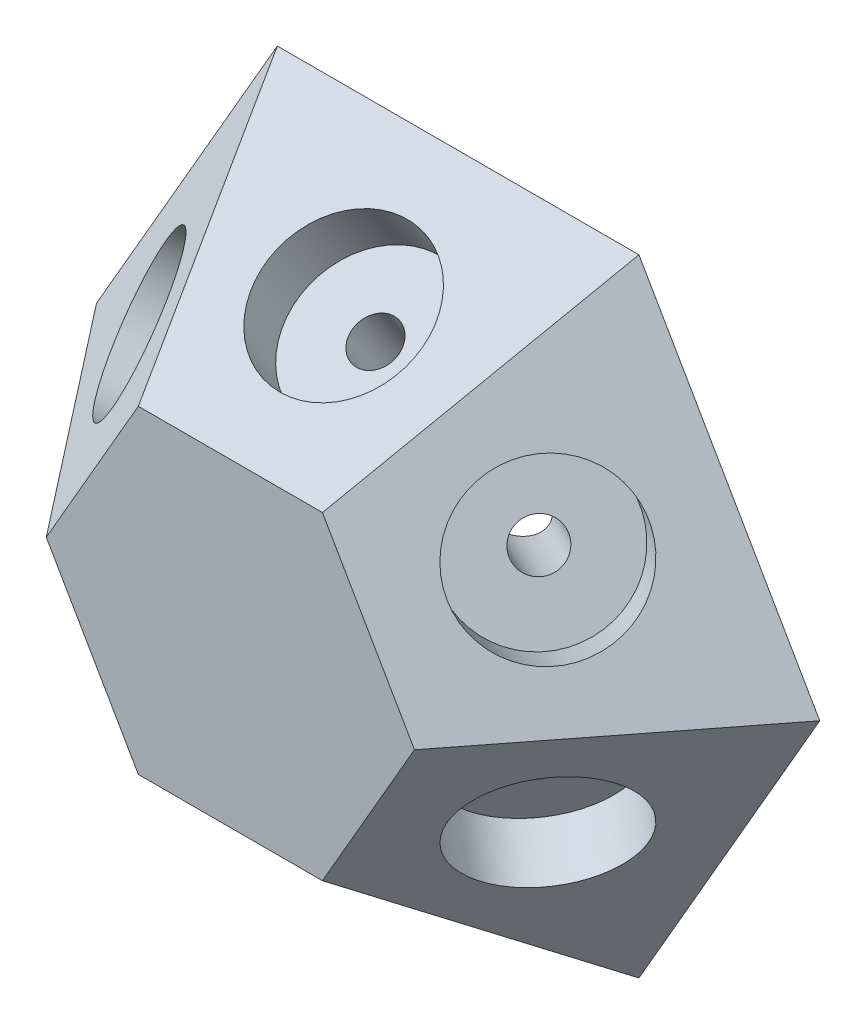
ISO-10303-21;
HEADER;
FILE_DESCRIPTION(('STEP AP214'),'2;1');
FILE_NAME('part.step','',(''),(''),'','','');
FILE_SCHEMA(('AUTOMOTIVE_DESIGN { 1 0 10303 214 1 1 1 1 }'));
ENDSEC;
DATA;
#1=APPLICATION_CONTEXT('core data for automotive mechanical design processes');
#2=APPLICATION_PROTOCOL_DEFINITION('international standard','automotive_design',2000,#1);
#3=PRODUCT_CONTEXT('',#1,'mechanical');
#4=PRODUCT('Part','Part','',(#3));
#5=PRODUCT_RELATED_PRODUCT_CATEGORY('part','',(#4));
#6=PRODUCT_DEFINITION_FORMATION('','',#4);
#7=PRODUCT_DEFINITION_CONTEXT('part definition',#1,'design');
#8=PRODUCT_DEFINITION('design','',#6,#7);
#9=PRODUCT_DEFINITION_SHAPE('','',#8);
#10=(LENGTH_UNIT() NAMED_UNIT(*) SI_UNIT(.MILLI.,.METRE.));
#11=(NAMED_UNIT(*) PLANE_ANGLE_UNIT() SI_UNIT($,.RADIAN.));
#12=(NAMED_UNIT(*) SI_UNIT($,.STERADIAN.) SOLID_ANGLE_UNIT());
#13=UNCERTAINTY_MEASURE_WITH_UNIT(LENGTH_MEASURE(1.E-05),#10,'distance_accuracy_value','');
#14=(GEOMETRIC_REPRESENTATION_CONTEXT(3) GLOBAL_UNCERTAINTY_ASSIGNED_CONTEXT((#13)) GLOBAL_UNIT_ASSIGNED_CONTEXT((#10,
#11,#12)) REPRESENTATION_CONTEXT('',''));
#15=CARTESIAN_POINT('',(0.,0.,0.));
#16=DIRECTION('',(0.,0.,1.));
#17=DIRECTION('',(1.,0.,0.));
#18=AXIS2_PLACEMENT_3D('',#15,#16,#17);
#19=CARTESIAN_POINT('',(0.,0.,20.));
#20=DIRECTION('',(0.,0.,1.));
#21=DIRECTION('',(1.,0.,0.));
#22=AXIS2_PLACEMENT_3D('',#19,#20,#21);
#23=PLANE('',#22);
#24=DIRECTION('',(-0.5,-0.866025403784439,0.));
#25=VECTOR('',#24,1.);
#26=CARTESIAN_POINT('',(-8.08290376865476,14.,20.));
#27=LINE('',#26,#25);
#28=CARTESIAN_POINT('',(-8.08290376865476,14.,20.));
#29=VERTEX_POINT('',#28);
#30=CARTESIAN_POINT('',(-16.1658075373095,0.,20.));
#31=VERTEX_POINT('',#30);
#32=EDGE_CURVE('E130',#29,#31,#27,.T.);
#33=ORIENTED_EDGE('',*,*,#32,.T.);
#34=DIRECTION('',(0.5,-0.866025403784438,0.));
#35=VECTOR('',#34,1.);
#36=CARTESIAN_POINT('',(-16.1658075373095,0.,20.));
#37=LINE('',#36,#35);
#38=CARTESIAN_POINT('',(-8.08290376865476,-14.,20.));
#39=VERTEX_POINT('',#38);
#40=EDGE_CURVE('E177',#31,#39,#37,.T.);
#41=ORIENTED_EDGE('',*,*,#40,.T.);
#42=DIRECTION('',(1.,0.,0.));
#43=VECTOR('',#42,1.);
#44=CARTESIAN_POINT('',(-8.08290376865476,-14.,20.));
#45=LINE('',#44,#43);
#46=CARTESIAN_POINT('',(8.08290376865476,-14.,20.));
#47=VERTEX_POINT('',#46);
#48=EDGE_CURVE('E335',#39,#47,#45,.T.);
#49=ORIENTED_EDGE('',*,*,#48,.T.);
#50=DIRECTION('',(0.5,0.866025403784439,0.));
#51=VECTOR('',#50,1.);
#52=CARTESIAN_POINT('',(8.08290376865476,-14.,20.));
#53=LINE('',#52,#51);
#54=CARTESIAN_POINT('',(16.1658075373095,0.,20.));
#55=VERTEX_POINT('',#54);
#56=EDGE_CURVE('E329',#47,#55,#53,.T.);
#57=ORIENTED_EDGE('',*,*,#56,.T.);
#58=DIRECTION('',(-0.5,0.866025403784439,0.));
#59=VECTOR('',#58,1.);
#60=CARTESIAN_POINT('',(16.1658075373095,0.,20.));
#61=LINE('',#60,#59);
#62=CARTESIAN_POINT('',(8.08290376865476,14.,20.));
#63=VERTEX_POINT('',#62);
#64=EDGE_CURVE('E57',#55,#63,#61,.T.);
#65=ORIENTED_EDGE('',*,*,#64,.T.);
#66=DIRECTION('',(-1.,0.,0.));
#67=VECTOR('',#66,1.);
#68=CARTESIAN_POINT('',(8.08290376865476,14.,20.));
#69=LINE('',#68,#67);
#70=EDGE_CURVE('E12',#63,#29,#69,.T.);
#71=ORIENTED_EDGE('',*,*,#70,.T.);
#72=EDGE_LOOP('',(#33,#41,#49,#57,#65,#71));
#73=FACE_BOUND('',#72,.T.);
#74=ADVANCED_FACE('F47',(#73),#23,.T.);
#75=CARTESIAN_POINT('',(0.,0.,0.));
#76=DIRECTION('',(0.,0.,1.));
#77=DIRECTION('',(1.,0.,0.));
#78=AXIS2_PLACEMENT_3D('',#75,#76,#77);
#79=PLANE('',#78);
#80=CARTESIAN_POINT('',(5.03951628677124,2.90956608475287,0.));
#81=DIRECTION('',(0.,0.,1.));
#82=DIRECTION('',(0.86602540378444,0.499999999999998,0.));
#83=AXIS2_PLACEMENT_3D('',#80,#81,#82);
#84=ELLIPSE('',#83,3.57479363318923,2.);
#85=CARTESIAN_POINT('',(8.13537838639999,4.69696290134747,0.));
#86=VERTEX_POINT('',#85);
#87=EDGE_CURVE('E414',#86,#86,#84,.T.);
#88=ORIENTED_EDGE('',*,*,#87,.T.);
#89=EDGE_LOOP('',(#88));
#90=FACE_BOUND('',#89,.T.);
#91=CARTESIAN_POINT('',(5.03951628677123,-2.9095660847529,0.));
#92=DIRECTION('',(0.,0.,1.));
#93=DIRECTION('',(0.866025403784436,-0.500000000000004,0.));
#94=AXIS2_PLACEMENT_3D('',#91,#92,#93);
#95=ELLIPSE('',#94,3.57479363318923,2.);
#96=CARTESIAN_POINT('',(8.13537838639996,-4.69696290134753,0.));
#97=VERTEX_POINT('',#96);
#98=EDGE_CURVE('E419',#97,#97,#95,.T.);
#99=ORIENTED_EDGE('',*,*,#98,.T.);
#100=EDGE_LOOP('',(#99));
#101=FACE_BOUND('',#100,.T.);
#102=CARTESIAN_POINT('',(0.,-5.81913216950575,0.));
#103=DIRECTION('',(0.,0.,1.));
#104=DIRECTION('',(0.,-1.,0.));
#105=AXIS2_PLACEMENT_3D('',#102,#103,#104);
#106=ELLIPSE('',#105,3.57479363318923,2.);
#107=CARTESIAN_POINT('',(0.,-9.39392580269499,0.));
#108=VERTEX_POINT('',#107);
#109=EDGE_CURVE('E422',#108,#108,#106,.T.);
#110=ORIENTED_EDGE('',*,*,#109,.T.);
#111=EDGE_LOOP('',(#110));
#112=FACE_BOUND('',#111,.T.);
#113=CARTESIAN_POINT('',(-5.0395162867712,2.90956608475293,0.));
#114=DIRECTION('',(0.,0.,1.));
#115=DIRECTION('',(-0.866025403784433,0.50000000000001,0.));
#116=AXIS2_PLACEMENT_3D('',#113,#114,#115);
#117=ELLIPSE('',#116,3.57479363318923,2.);
#118=CARTESIAN_POINT('',(-8.13537838639992,4.69696290134759,0.));
#119=VERTEX_POINT('',#118);
#120=EDGE_CURVE('E428',#119,#119,#117,.T.);
#121=ORIENTED_EDGE('',*,*,#120,.T.);
#122=EDGE_LOOP('',(#121));
#123=FACE_BOUND('',#122,.T.);
#124=CARTESIAN_POINT('',(-5.03951628677126,-2.90956608475283,0.));
#125=DIRECTION('',(0.,0.,1.));
#126=DIRECTION('',(-0.866025403784443,-0.499999999999992,0.));
#127=AXIS2_PLACEMENT_3D('',#124,#125,#126);
#128=ELLIPSE('',#127,3.57479363318923,2.);
#129=CARTESIAN_POINT('',(-8.13537838640003,-4.69696290134742,0.));
#130=VERTEX_POINT('',#129);
#131=EDGE_CURVE('E425',#130,#130,#128,.T.);
#132=ORIENTED_EDGE('',*,*,#131,.T.);
#133=EDGE_LOOP('',(#132));
#134=FACE_BOUND('',#133,.T.);
#135=CARTESIAN_POINT('',(0.,5.81913216950575,0.));
#136=DIRECTION('',(0.,0.,1.));
#137=DIRECTION('',(0.,1.,0.));
#138=AXIS2_PLACEMENT_3D('',#135,#136,#137);
#139=ELLIPSE('',#138,3.57479363318923,2.);
#140=CARTESIAN_POINT('',(0.,9.39392580269499,0.));
#141=VERTEX_POINT('',#140);
#142=EDGE_CURVE('E378',#141,#141,#139,.T.);
#143=ORIENTED_EDGE('',*,*,#142,.T.);
#144=EDGE_LOOP('',(#143));
#145=FACE_BOUND('',#144,.T.);
#146=DIRECTION('',(-1.,0.,0.));
#147=VECTOR('',#146,1.);
#148=CARTESIAN_POINT('',(15.8771324027147,27.5,0.));
#149=LINE('',#148,#147);
#150=CARTESIAN_POINT('',(15.8771324027147,27.5,0.));
#151=VERTEX_POINT('',#150);
#152=CARTESIAN_POINT('',(-15.8771324027147,27.5,0.));
#153=VERTEX_POINT('',#152);
#154=EDGE_CURVE('E107',#151,#153,#149,.T.);
#155=ORIENTED_EDGE('',*,*,#154,.F.);
#156=DIRECTION('',(-0.5,0.866025403784439,0.));
#157=VECTOR('',#156,1.);
#158=CARTESIAN_POINT('',(31.7542648054294,0.,0.));
#159=LINE('',#158,#157);
#160=CARTESIAN_POINT('',(31.7542648054294,0.,0.));
#161=VERTEX_POINT('',#160);
#162=EDGE_CURVE('E138',#161,#151,#159,.T.);
#163=ORIENTED_EDGE('',*,*,#162,.F.);
#164=DIRECTION('',(0.5,0.866025403784439,0.));
#165=VECTOR('',#164,1.);
#166=CARTESIAN_POINT('',(15.8771324027147,-27.5,0.));
#167=LINE('',#166,#165);
#168=CARTESIAN_POINT('',(15.8771324027147,-27.5,0.));
#169=VERTEX_POINT('',#168);
#170=EDGE_CURVE('E231',#169,#161,#167,.T.);
#171=ORIENTED_EDGE('',*,*,#170,.F.);
#172=DIRECTION('',(1.,0.,0.));
#173=VECTOR('',#172,1.);
#174=CARTESIAN_POINT('',(-15.8771324027147,-27.5,0.));
#175=LINE('',#174,#173);
#176=CARTESIAN_POINT('',(-15.8771324027147,-27.5,0.));
#177=VERTEX_POINT('',#176);
#178=EDGE_CURVE('E213',#177,#169,#175,.T.);
#179=ORIENTED_EDGE('',*,*,#178,.F.);
#180=DIRECTION('',(0.5,-0.866025403784439,0.));
#181=VECTOR('',#180,1.);
#182=CARTESIAN_POINT('',(-31.7542648054294,0.,0.));
#183=LINE('',#182,#181);
#184=CARTESIAN_POINT('',(-31.7542648054294,0.,0.));
#185=VERTEX_POINT('',#184);
#186=EDGE_CURVE('E110',#185,#177,#183,.T.);
#187=ORIENTED_EDGE('',*,*,#186,.F.);
#188=DIRECTION('',(-0.5,-0.866025403784439,0.));
#189=VECTOR('',#188,1.);
#190=CARTESIAN_POINT('',(-15.8771324027147,27.5,0.));
#191=LINE('',#190,#189);
#192=EDGE_CURVE('E103',#153,#185,#191,.T.);
#193=ORIENTED_EDGE('',*,*,#192,.F.);
#194=EDGE_LOOP('',(#155,#163,#171,#179,#187,#193));
#195=FACE_BOUND('',#194,.T.);
#196=ADVANCED_FACE('F106',(#90,#101,#112,#123,#134,#145,#195),#79,.F.);
#197=CARTESIAN_POINT('',(-16.3611497494699,9.44611421210819,12.7522541863461));
#198=DIRECTION('',(0.71780400764256,-0.414424337037824,-0.559472855001063));
#199=DIRECTION('',(-0.614748744335862,0.,-0.788723006725099));
#200=AXIS2_PLACEMENT_3D('',#197,#198,#199);
#201=PLANE('',#200);
#202=CARTESIAN_POINT('',(-17.9385681148868,10.3568371300066,10.0538159110922));
#203=DIRECTION('',(-0.717804007642555,0.414424337037833,0.559472855001062));
#204=DIRECTION('',(0.484517705158724,-0.279736427500537,0.828848674075648));
#205=AXIS2_PLACEMENT_3D('',#202,#203,#204);
#206=CIRCLE('',#205,6.75);
#207=CARTESIAN_POINT('',(-14.6680736050654,8.46861624437796,15.6485444611028));
#208=VERTEX_POINT('',#207);
#209=EDGE_CURVE('E411',#208,#208,#206,.T.);
#210=ORIENTED_EDGE('',*,*,#209,.F.);
#211=EDGE_LOOP('',(#210));
#212=FACE_BOUND('',#211,.T.);
#213=DIRECTION('',(0.614748744335862,0.,0.788723006725099));
#214=VECTOR('',#213,1.);
#215=CARTESIAN_POINT('',(-31.7542648054294,0.,0.));
#216=LINE('',#215,#214);
#217=EDGE_CURVE('E133',#185,#31,#216,.T.);
#218=ORIENTED_EDGE('',*,*,#217,.T.);
#219=ORIENTED_EDGE('',*,*,#32,.F.);
#220=DIRECTION('',(0.307374372167931,-0.532388029539442,0.788723006725099));
#221=VECTOR('',#220,1.);
#222=CARTESIAN_POINT('',(-15.8771324027147,27.5,0.));
#223=LINE('',#222,#221);
#224=EDGE_CURVE('E124',#153,#29,#223,.T.);
#225=ORIENTED_EDGE('',*,*,#224,.F.);
#226=ORIENTED_EDGE('',*,*,#192,.T.);
#227=EDGE_LOOP('',(#218,#219,#225,#226));
#228=FACE_BOUND('',#227,.T.);
#229=ADVANCED_FACE('F129',(#212,#228),#201,.F.);
#230=CARTESIAN_POINT('',(0.,18.8922284242164,12.7522541863461));
#231=DIRECTION('',(0.,-0.828848674075648,-0.559472855001062));
#232=DIRECTION('',(0.,0.559472855001062,-0.828848674075648));
#233=AXIS2_PLACEMENT_3D('',#230,#231,#232);
#234=PLANE('',#233);
#235=CARTESIAN_POINT('',(0.,20.7136742600128,10.0538159110922));
#236=DIRECTION('',(0.,0.828848674075649,0.559472855001062));
#237=DIRECTION('',(0.,-0.559472855001062,0.828848674075648));
#238=AXIS2_PLACEMENT_3D('',#235,#236,#237);
#239=CIRCLE('',#238,6.75);
#240=CARTESIAN_POINT('',(0.,16.9372324887556,15.6485444611028));
#241=VERTEX_POINT('',#240);
#242=EDGE_CURVE('E375',#241,#241,#239,.T.);
#243=ORIENTED_EDGE('',*,*,#242,.F.);
#244=EDGE_LOOP('',(#243));
#245=FACE_BOUND('',#244,.T.);
#246=ORIENTED_EDGE('',*,*,#224,.T.);
#247=ORIENTED_EDGE('',*,*,#70,.F.);
#248=DIRECTION('',(-0.307374372167931,-0.532388029539441,0.788723006725099));
#249=VECTOR('',#248,1.);
#250=CARTESIAN_POINT('',(15.8771324027147,27.5,0.));
#251=LINE('',#250,#249);
#252=EDGE_CURVE('E72',#151,#63,#251,.T.);
#253=ORIENTED_EDGE('',*,*,#252,.F.);
#254=ORIENTED_EDGE('',*,*,#154,.T.);
#255=EDGE_LOOP('',(#246,#247,#253,#254));
#256=FACE_BOUND('',#255,.T.);
#257=ADVANCED_FACE('F123',(#245,#256),#234,.F.);
#258=CARTESIAN_POINT('',(-16.3611497494699,-9.4461142121082,12.7522541863461));
#259=DIRECTION('',(0.71780400764256,0.414424337037824,-0.559472855001062));
#260=DIRECTION('',(-0.614748744335862,0.,-0.788723006725099));
#261=AXIS2_PLACEMENT_3D('',#258,#259,#260);
#262=PLANE('',#261);
#263=CARTESIAN_POINT('',(-17.938568114887,-10.3568371300062,10.0538159110922));
#264=DIRECTION('',(-0.717804007642564,-0.414424337037818,0.559472855001062));
#265=DIRECTION('',(0.48451770515873,0.279736427500527,0.828848674075648));
#266=AXIS2_PLACEMENT_3D('',#263,#264,#265);
#267=CIRCLE('',#266,6.75);
#268=CARTESIAN_POINT('',(-14.6680736050655,-8.46861624437766,15.6485444611028));
#269=VERTEX_POINT('',#268);
#270=EDGE_CURVE('E405',#269,#269,#267,.T.);
#271=ORIENTED_EDGE('',*,*,#270,.F.);
#272=EDGE_LOOP('',(#271));
#273=FACE_BOUND('',#272,.T.);
#274=DIRECTION('',(0.307374372167931,0.532388029539442,0.788723006725099));
#275=VECTOR('',#274,1.);
#276=CARTESIAN_POINT('',(-15.8771324027147,-27.5,0.));
#277=LINE('',#276,#275);
#278=EDGE_CURVE('E132',#177,#39,#277,.T.);
#279=ORIENTED_EDGE('',*,*,#278,.T.);
#280=ORIENTED_EDGE('',*,*,#40,.F.);
#281=ORIENTED_EDGE('',*,*,#217,.F.);
#282=ORIENTED_EDGE('',*,*,#186,.T.);
#283=EDGE_LOOP('',(#279,#280,#281,#282));
#284=FACE_BOUND('',#283,.T.);
#285=ADVANCED_FACE('F182',(#273,#284),#262,.F.);
#286=CARTESIAN_POINT('',(0.,-18.8922284242164,12.7522541863461));
#287=DIRECTION('',(0.,0.828848674075648,-0.559472855001063));
#288=DIRECTION('',(0.,0.559472855001063,0.828848674075648));
#289=AXIS2_PLACEMENT_3D('',#286,#287,#288);
#290=PLANE('',#289);
#291=CARTESIAN_POINT('',(0.,-20.7136742600128,10.0538159110922));
#292=DIRECTION('',(0.,-0.828848674075649,0.559472855001062));
#293=DIRECTION('',(0.,0.559472855001062,0.828848674075648));
#294=AXIS2_PLACEMENT_3D('',#291,#292,#293);
#295=CIRCLE('',#294,6.75);
#296=CARTESIAN_POINT('',(0.,-16.9372324887556,15.6485444611028));
#297=VERTEX_POINT('',#296);
#298=EDGE_CURVE('E399',#297,#297,#295,.T.);
#299=ORIENTED_EDGE('',*,*,#298,.F.);
#300=EDGE_LOOP('',(#299));
#301=FACE_BOUND('',#300,.T.);
#302=DIRECTION('',(-0.307374372167931,0.532388029539442,0.788723006725099));
#303=VECTOR('',#302,1.);
#304=CARTESIAN_POINT('',(15.8771324027147,-27.5,0.));
#305=LINE('',#304,#303);
#306=EDGE_CURVE('E136',#169,#47,#305,.T.);
#307=ORIENTED_EDGE('',*,*,#306,.T.);
#308=ORIENTED_EDGE('',*,*,#48,.F.);
#309=ORIENTED_EDGE('',*,*,#278,.F.);
#310=ORIENTED_EDGE('',*,*,#178,.T.);
#311=EDGE_LOOP('',(#307,#308,#309,#310));
#312=FACE_BOUND('',#311,.T.);
#313=ADVANCED_FACE('F191',(#301,#312),#290,.F.);
#314=CARTESIAN_POINT('',(16.3611497494699,-9.4461142121082,12.7522541863461));
#315=DIRECTION('',(-0.71780400764256,0.414424337037824,-0.559472855001063));
#316=DIRECTION('',(-0.614748744335862,0.,0.788723006725099));
#317=AXIS2_PLACEMENT_3D('',#314,#315,#316);
#318=PLANE('',#317);
#319=CARTESIAN_POINT('',(17.9385681148868,-10.3568371300065,10.0538159110922));
#320=DIRECTION('',(0.717804007642558,-0.414424337037828,0.559472855001062));
#321=DIRECTION('',(-0.484517705158726,0.279736427500533,0.828848674075648));
#322=AXIS2_PLACEMENT_3D('',#319,#320,#321);
#323=CIRCLE('',#322,6.75);
#324=CARTESIAN_POINT('',(14.6680736050654,-8.46861624437786,15.6485444611028));
#325=VERTEX_POINT('',#324);
#326=EDGE_CURVE('E393',#325,#325,#323,.T.);
#327=ORIENTED_EDGE('',*,*,#326,.F.);
#328=EDGE_LOOP('',(#327));
#329=FACE_BOUND('',#328,.T.);
#330=DIRECTION('',(-0.614748744335862,0.,0.788723006725099));
#331=VECTOR('',#330,1.);
#332=CARTESIAN_POINT('',(31.7542648054294,0.,0.));
#333=LINE('',#332,#331);
#334=EDGE_CURVE('E224',#161,#55,#333,.T.);
#335=ORIENTED_EDGE('',*,*,#334,.T.);
#336=ORIENTED_EDGE('',*,*,#56,.F.);
#337=ORIENTED_EDGE('',*,*,#306,.F.);
#338=ORIENTED_EDGE('',*,*,#170,.T.);
#339=EDGE_LOOP('',(#335,#336,#337,#338));
#340=FACE_BOUND('',#339,.T.);
#341=ADVANCED_FACE('F236',(#329,#340),#318,.F.);
#342=CARTESIAN_POINT('',(16.3611497494699,9.44611421210821,12.7522541863461));
#343=DIRECTION('',(-0.71780400764256,-0.414424337037824,-0.559472855001063));
#344=DIRECTION('',(-0.614748744335863,0.,0.788723006725099));
#345=AXIS2_PLACEMENT_3D('',#342,#343,#344);
#346=PLANE('',#345);
#347=CARTESIAN_POINT('',(17.9385681148869,10.3568371300063,10.0538159110922));
#348=DIRECTION('',(0.717804007642561,0.414424337037823,0.559472855001062));
#349=DIRECTION('',(-0.484517705158728,-0.27973642750053,0.828848674075648));
#350=AXIS2_PLACEMENT_3D('',#347,#348,#349);
#351=CIRCLE('',#350,6.75);
#352=CARTESIAN_POINT('',(14.6680736050655,8.46861624437776,15.6485444611028));
#353=VERTEX_POINT('',#352);
#354=EDGE_CURVE('E387',#353,#353,#351,.T.);
#355=ORIENTED_EDGE('',*,*,#354,.F.);
#356=EDGE_LOOP('',(#355));
#357=FACE_BOUND('',#356,.T.);
#358=ORIENTED_EDGE('',*,*,#252,.T.);
#359=ORIENTED_EDGE('',*,*,#64,.F.);
#360=ORIENTED_EDGE('',*,*,#334,.F.);
#361=ORIENTED_EDGE('',*,*,#162,.T.);
#362=EDGE_LOOP('',(#358,#359,#360,#361));
#363=FACE_BOUND('',#362,.T.);
#364=ADVANCED_FACE('F244',(#357,#363),#346,.F.);
#365=CARTESIAN_POINT('',(0.,16.5694308896345,7.25645163608691));
#366=DIRECTION('',(0.,0.828848674075648,0.559472855001062));
#367=DIRECTION('',(0.,-0.559472855001062,0.828848674075648));
#368=AXIS2_PLACEMENT_3D('',#365,#366,#367);
#369=CYLINDRICAL_SURFACE('',#368,6.75);
#370=CARTESIAN_POINT('',(0.,16.5694308896345,7.25645163608691));
#371=DIRECTION('',(0.,0.828848674075649,0.559472855001062));
#372=DIRECTION('',(0.,-0.559472855001062,0.828848674075648));
#373=AXIS2_PLACEMENT_3D('',#370,#371,#372);
#374=CIRCLE('',#373,6.75);
#375=CARTESIAN_POINT('',(0.,12.7929891183773,12.8511801860975));
#376=VERTEX_POINT('',#375);
#377=EDGE_CURVE('E125',#376,#376,#374,.T.);
#378=ORIENTED_EDGE('',*,*,#377,.F.);
#379=EDGE_LOOP('',(#378));
#380=FACE_BOUND('',#379,.T.);
#381=ORIENTED_EDGE('',*,*,#242,.T.);
#382=EDGE_LOOP('',(#381));
#383=FACE_BOUND('',#382,.T.);
#384=ADVANCED_FACE('F500',(#380,#383),#369,.F.);
#385=CARTESIAN_POINT('',(0.,16.5694308896345,7.25645163608691));
#386=DIRECTION('',(0.,0.828848674075649,0.559472855001062));
#387=DIRECTION('',(0.,-0.559472855001062,0.828848674075648));
#388=AXIS2_PLACEMENT_3D('',#385,#386,#387);
#389=PLANE('',#388);
#390=CARTESIAN_POINT('',(0.,16.5694308896345,7.25645163608691));
#391=DIRECTION('',(0.,0.828848674075648,0.559472855001062));
#392=DIRECTION('',(0.,-0.559472855001062,0.828848674075648));
#393=AXIS2_PLACEMENT_3D('',#390,#391,#392);
#394=CIRCLE('',#393,2.);
#395=CARTESIAN_POINT('',(0.,15.4504851796324,8.9141489842382));
#396=VERTEX_POINT('',#395);
#397=EDGE_CURVE('E383',#396,#396,#394,.T.);
#398=ORIENTED_EDGE('',*,*,#397,.F.);
#399=EDGE_LOOP('',(#398));
#400=FACE_BOUND('',#399,.T.);
#401=ORIENTED_EDGE('',*,*,#377,.T.);
#402=EDGE_LOOP('',(#401));
#403=FACE_BOUND('',#402,.T.);
#404=ADVANCED_FACE('F490',(#400,#403),#389,.T.);
#405=CARTESIAN_POINT('',(0.,-20.7287594437697,-17.9198268389609));
#406=DIRECTION('',(0.,0.828848674075648,0.559472855001062));
#407=DIRECTION('',(0.,-0.559472855001062,0.828848674075649));
#408=AXIS2_PLACEMENT_3D('',#405,#406,#407);
#409=CYLINDRICAL_SURFACE('',#408,2.);
#410=ORIENTED_EDGE('',*,*,#397,.T.);
#411=EDGE_LOOP('',(#410));
#412=FACE_BOUND('',#411,.T.);
#413=ORIENTED_EDGE('',*,*,#142,.F.);
#414=EDGE_LOOP('',(#413));
#415=FACE_BOUND('',#414,.T.);
#416=ADVANCED_FACE('F487',(#412,#415),#409,.F.);
#417=CARTESIAN_POINT('',(14.3495480766741,8.28471544481723,7.25645163608691));
#418=DIRECTION('',(0.717804007642561,0.414424337037823,0.559472855001062));
#419=DIRECTION('',(0.614748744335862,0.,-0.7887230067251));
#420=AXIS2_PLACEMENT_3D('',#417,#418,#419);
#421=CYLINDRICAL_SURFACE('',#420,6.75);
#422=CARTESIAN_POINT('',(14.3495480766741,8.28471544481723,7.25645163608691));
#423=DIRECTION('',(0.717804007642561,0.414424337037823,0.559472855001062));
#424=DIRECTION('',(-0.484517705158728,-0.27973642750053,0.828848674075648));
#425=AXIS2_PLACEMENT_3D('',#422,#423,#424);
#426=CIRCLE('',#425,6.75);
#427=CARTESIAN_POINT('',(11.0790535668527,6.39649455918865,12.8511801860975));
#428=VERTEX_POINT('',#427);
#429=EDGE_CURVE('E386',#428,#428,#426,.T.);
#430=ORIENTED_EDGE('',*,*,#429,.F.);
#431=EDGE_LOOP('',(#430));
#432=FACE_BOUND('',#431,.T.);
#433=ORIENTED_EDGE('',*,*,#354,.T.);
#434=EDGE_LOOP('',(#433));
#435=FACE_BOUND('',#434,.T.);
#436=ADVANCED_FACE('F489',(#432,#435),#421,.F.);
#437=CARTESIAN_POINT('',(14.3495480766741,8.28471544481723,7.25645163608691));
#438=DIRECTION('',(0.717804007642561,0.414424337037823,0.559472855001062));
#439=DIRECTION('',(-0.484517705158728,-0.27973642750053,0.828848674075648));
#440=AXIS2_PLACEMENT_3D('',#437,#438,#439);
#441=PLANE('',#440);
#442=CARTESIAN_POINT('',(14.3495480766741,8.28471544481723,7.25645163608691));
#443=DIRECTION('',(0.717804007642561,0.414424337037823,0.559472855001062));
#444=DIRECTION('',(-0.484517705158728,-0.27973642750053,0.828848674075648));
#445=AXIS2_PLACEMENT_3D('',#442,#443,#444);
#446=CIRCLE('',#445,2.);
#447=CARTESIAN_POINT('',(13.3805126663566,7.72524258981617,8.9141489842382));
#448=VERTEX_POINT('',#447);
#449=EDGE_CURVE('E431',#448,#448,#446,.T.);
#450=ORIENTED_EDGE('',*,*,#449,.F.);
#451=EDGE_LOOP('',(#450));
#452=FACE_BOUND('',#451,.T.);
#453=ORIENTED_EDGE('',*,*,#429,.T.);
#454=EDGE_LOOP('',(#453));
#455=FACE_BOUND('',#454,.T.);
#456=ADVANCED_FACE('F497',(#452,#455),#441,.T.);
#457=CARTESIAN_POINT('',(14.349548076674,-8.28471544481732,7.25645163608691));
#458=DIRECTION('',(0.717804007642558,-0.414424337037827,0.559472855001062));
#459=DIRECTION('',(0.614748744335863,0.,-0.788723006725098));
#460=AXIS2_PLACEMENT_3D('',#457,#458,#459);
#461=CYLINDRICAL_SURFACE('',#460,6.75);
#462=CARTESIAN_POINT('',(14.349548076674,-8.28471544481732,7.25645163608691));
#463=DIRECTION('',(0.717804007642558,-0.414424337037828,0.559472855001062));
#464=DIRECTION('',(-0.484517705158726,0.279736427500533,0.828848674075648));
#465=AXIS2_PLACEMENT_3D('',#462,#463,#464);
#466=CIRCLE('',#465,6.75);
#467=CARTESIAN_POINT('',(11.0790535668526,-6.39649455918872,12.8511801860975));
#468=VERTEX_POINT('',#467);
#469=EDGE_CURVE('E390',#468,#468,#466,.T.);
#470=ORIENTED_EDGE('',*,*,#469,.F.);
#471=EDGE_LOOP('',(#470));
#472=FACE_BOUND('',#471,.T.);
#473=ORIENTED_EDGE('',*,*,#326,.T.);
#474=EDGE_LOOP('',(#473));
#475=FACE_BOUND('',#474,.T.);
#476=ADVANCED_FACE('F554',(#472,#475),#461,.F.);
#477=CARTESIAN_POINT('',(14.349548076674,-8.28471544481732,7.25645163608691));
#478=DIRECTION('',(0.717804007642558,-0.414424337037828,0.559472855001062));
#479=DIRECTION('',(-0.484517705158726,0.279736427500533,0.828848674075648));
#480=AXIS2_PLACEMENT_3D('',#477,#478,#479);
#481=PLANE('',#480);
#482=CARTESIAN_POINT('',(14.349548076674,-8.28471544481732,7.25645163608691));
#483=DIRECTION('',(0.717804007642558,-0.414424337037828,0.559472855001062));
#484=DIRECTION('',(-0.484517705158726,0.279736427500533,0.828848674075648));
#485=AXIS2_PLACEMENT_3D('',#482,#483,#484);
#486=CIRCLE('',#485,2.);
#487=CARTESIAN_POINT('',(13.3805126663566,-7.72524258981626,8.9141489842382));
#488=VERTEX_POINT('',#487);
#489=EDGE_CURVE('E434',#488,#488,#486,.T.);
#490=ORIENTED_EDGE('',*,*,#489,.F.);
#491=EDGE_LOOP('',(#490));
#492=FACE_BOUND('',#491,.T.);
#493=ORIENTED_EDGE('',*,*,#469,.T.);
#494=EDGE_LOOP('',(#493));
#495=FACE_BOUND('',#494,.T.);
#496=ADVANCED_FACE('F563',(#492,#495),#481,.T.);
#497=CARTESIAN_POINT('',(0.,-16.5694308896345,7.25645163608691));
#498=DIRECTION('',(0.,-0.828848674075648,0.559472855001062));
#499=DIRECTION('',(0.,-0.559472855001062,-0.828848674075648));
#500=AXIS2_PLACEMENT_3D('',#497,#498,#499);
#501=CYLINDRICAL_SURFACE('',#500,6.75);
#502=CARTESIAN_POINT('',(0.,-16.5694308896345,7.25645163608691));
#503=DIRECTION('',(0.,-0.828848674075649,0.559472855001062));
#504=DIRECTION('',(0.,0.559472855001062,0.828848674075648));
#505=AXIS2_PLACEMENT_3D('',#502,#503,#504);
#506=CIRCLE('',#505,6.75);
#507=CARTESIAN_POINT('',(0.,-12.7929891183773,12.8511801860975));
#508=VERTEX_POINT('',#507);
#509=EDGE_CURVE('E396',#508,#508,#506,.T.);
#510=ORIENTED_EDGE('',*,*,#509,.F.);
#511=EDGE_LOOP('',(#510));
#512=FACE_BOUND('',#511,.T.);
#513=ORIENTED_EDGE('',*,*,#298,.T.);
#514=EDGE_LOOP('',(#513));
#515=FACE_BOUND('',#514,.T.);
#516=ADVANCED_FACE('F573',(#512,#515),#501,.F.);
#517=CARTESIAN_POINT('',(0.,-16.5694308896345,7.25645163608691));
#518=DIRECTION('',(0.,-0.828848674075649,0.559472855001062));
#519=DIRECTION('',(0.,0.559472855001062,0.828848674075648));
#520=AXIS2_PLACEMENT_3D('',#517,#518,#519);
#521=PLANE('',#520);
#522=CARTESIAN_POINT('',(0.,-16.5694308896345,7.25645163608691));
#523=DIRECTION('',(0.,-0.828848674075648,0.559472855001062));
#524=DIRECTION('',(0.,0.559472855001062,0.828848674075648));
#525=AXIS2_PLACEMENT_3D('',#522,#523,#524);
#526=CIRCLE('',#525,2.);
#527=CARTESIAN_POINT('',(0.,-15.4504851796324,8.9141489842382));
#528=VERTEX_POINT('',#527);
#529=EDGE_CURVE('E437',#528,#528,#526,.T.);
#530=ORIENTED_EDGE('',*,*,#529,.F.);
#531=EDGE_LOOP('',(#530));
#532=FACE_BOUND('',#531,.T.);
#533=ORIENTED_EDGE('',*,*,#509,.T.);
#534=EDGE_LOOP('',(#533));
#535=FACE_BOUND('',#534,.T.);
#536=ADVANCED_FACE('F583',(#532,#535),#521,.T.);
#537=CARTESIAN_POINT('',(-14.3495480766742,-8.28471544481713,7.25645163608691));
#538=DIRECTION('',(-0.717804007642564,-0.414424337037818,0.559472855001062));
#539=DIRECTION('',(0.61474874433586,0.,0.788723006725101));
#540=AXIS2_PLACEMENT_3D('',#537,#538,#539);
#541=CYLINDRICAL_SURFACE('',#540,6.75);
#542=CARTESIAN_POINT('',(-14.3495480766742,-8.28471544481713,7.25645163608691));
#543=DIRECTION('',(-0.717804007642564,-0.414424337037818,0.559472855001062));
#544=DIRECTION('',(0.48451770515873,0.279736427500527,0.828848674075648));
#545=AXIS2_PLACEMENT_3D('',#542,#543,#544);
#546=CIRCLE('',#545,6.75);
#547=CARTESIAN_POINT('',(-11.0790535668527,-6.39649455918857,12.8511801860975));
#548=VERTEX_POINT('',#547);
#549=EDGE_CURVE('E402',#548,#548,#546,.T.);
#550=ORIENTED_EDGE('',*,*,#549,.F.);
#551=EDGE_LOOP('',(#550));
#552=FACE_BOUND('',#551,.T.);
#553=ORIENTED_EDGE('',*,*,#270,.T.);
#554=EDGE_LOOP('',(#553));
#555=FACE_BOUND('',#554,.T.);
#556=ADVANCED_FACE('F465',(#552,#555),#541,.F.);
#557=CARTESIAN_POINT('',(-14.3495480766742,-8.28471544481713,7.25645163608691));
#558=DIRECTION('',(-0.717804007642564,-0.414424337037818,0.559472855001062));
#559=DIRECTION('',(0.48451770515873,0.279736427500527,0.828848674075648));
#560=AXIS2_PLACEMENT_3D('',#557,#558,#559);
#561=PLANE('',#560);
#562=CARTESIAN_POINT('',(-14.3495480766742,-8.28471544481713,7.25645163608691));
#563=DIRECTION('',(-0.717804007642564,-0.414424337037818,0.559472855001062));
#564=DIRECTION('',(0.48451770515873,0.279736427500527,0.828848674075648));
#565=AXIS2_PLACEMENT_3D('',#562,#563,#564);
#566=CIRCLE('',#565,2.);
#567=CARTESIAN_POINT('',(-13.3805126663567,-7.72524258981607,8.9141489842382));
#568=VERTEX_POINT('',#567);
#569=EDGE_CURVE('E440',#568,#568,#566,.T.);
#570=ORIENTED_EDGE('',*,*,#569,.F.);
#571=EDGE_LOOP('',(#570));
#572=FACE_BOUND('',#571,.T.);
#573=ORIENTED_EDGE('',*,*,#549,.T.);
#574=EDGE_LOOP('',(#573));
#575=FACE_BOUND('',#574,.T.);
#576=ADVANCED_FACE('F459',(#572,#575),#561,.T.);
#577=CARTESIAN_POINT('',(-14.349548076674,8.28471544481742,7.25645163608691));
#578=DIRECTION('',(-0.717804007642555,0.414424337037832,0.559472855001062));
#579=DIRECTION('',(0.614748744335865,0.,0.788723006725097));
#580=AXIS2_PLACEMENT_3D('',#577,#578,#579);
#581=CYLINDRICAL_SURFACE('',#580,6.75);
#582=CARTESIAN_POINT('',(-14.349548076674,8.28471544481742,7.25645163608691));
#583=DIRECTION('',(-0.717804007642555,0.414424337037833,0.559472855001062));
#584=DIRECTION('',(0.484517705158724,-0.279736427500537,0.828848674075648));
#585=AXIS2_PLACEMENT_3D('',#582,#583,#584);
#586=CIRCLE('',#585,6.75);
#587=CARTESIAN_POINT('',(-11.0790535668526,6.3964945591888,12.8511801860975));
#588=VERTEX_POINT('',#587);
#589=EDGE_CURVE('E408',#588,#588,#586,.T.);
#590=ORIENTED_EDGE('',*,*,#589,.F.);
#591=EDGE_LOOP('',(#590));
#592=FACE_BOUND('',#591,.T.);
#593=ORIENTED_EDGE('',*,*,#209,.T.);
#594=EDGE_LOOP('',(#593));
#595=FACE_BOUND('',#594,.T.);
#596=ADVANCED_FACE('F453',(#592,#595),#581,.F.);
#597=CARTESIAN_POINT('',(-14.349548076674,8.28471544481742,7.25645163608691));
#598=DIRECTION('',(-0.717804007642555,0.414424337037833,0.559472855001062));
#599=DIRECTION('',(0.484517705158724,-0.279736427500537,0.828848674075648));
#600=AXIS2_PLACEMENT_3D('',#597,#598,#599);
#601=PLANE('',#600);
#602=CARTESIAN_POINT('',(-14.349548076674,8.28471544481742,7.25645163608691));
#603=DIRECTION('',(-0.717804007642555,0.414424337037833,0.559472855001062));
#604=DIRECTION('',(0.484517705158724,-0.279736427500537,0.828848674075648));
#605=AXIS2_PLACEMENT_3D('',#602,#603,#604);
#606=CIRCLE('',#605,2.);
#607=CARTESIAN_POINT('',(-13.3805126663565,7.72524258981635,8.9141489842382));
#608=VERTEX_POINT('',#607);
#609=EDGE_CURVE('E443',#608,#608,#606,.T.);
#610=ORIENTED_EDGE('',*,*,#609,.F.);
#611=EDGE_LOOP('',(#610));
#612=FACE_BOUND('',#611,.T.);
#613=ORIENTED_EDGE('',*,*,#589,.T.);
#614=EDGE_LOOP('',(#613));
#615=FACE_BOUND('',#614,.T.);
#616=ADVANCED_FACE('F450',(#612,#615),#601,.T.);
#617=CARTESIAN_POINT('',(17.951632267241,-10.364379721885,-17.9198268389609));
#618=DIRECTION('',(-0.717804007642555,0.414424337037832,0.559472855001062));
#619=DIRECTION('',(0.614748744335865,0.,0.788723006725097));
#620=AXIS2_PLACEMENT_3D('',#617,#618,#619);
#621=CYLINDRICAL_SURFACE('',#620,2.);
#622=ORIENTED_EDGE('',*,*,#609,.T.);
#623=EDGE_LOOP('',(#622));
#624=FACE_BOUND('',#623,.T.);
#625=ORIENTED_EDGE('',*,*,#120,.F.);
#626=EDGE_LOOP('',(#625));
#627=FACE_BOUND('',#626,.T.);
#628=ADVANCED_FACE('F447',(#624,#627),#621,.F.);
#629=CARTESIAN_POINT('',(17.9516322672412,10.3643797218847,-17.9198268389609));
#630=DIRECTION('',(-0.717804007642564,-0.414424337037818,0.559472855001062));
#631=DIRECTION('',(0.61474874433586,0.,0.788723006725101));
#632=AXIS2_PLACEMENT_3D('',#629,#630,#631);
#633=CYLINDRICAL_SURFACE('',#632,2.);
#634=ORIENTED_EDGE('',*,*,#569,.T.);
#635=EDGE_LOOP('',(#634));
#636=FACE_BOUND('',#635,.T.);
#637=ORIENTED_EDGE('',*,*,#131,.F.);
#638=EDGE_LOOP('',(#637));
#639=FACE_BOUND('',#638,.T.);
#640=ADVANCED_FACE('F627',(#636,#639),#633,.F.);
#641=CARTESIAN_POINT('',(0.,20.7287594437697,-17.9198268389609));
#642=DIRECTION('',(0.,-0.828848674075648,0.559472855001062));
#643=DIRECTION('',(0.,-0.559472855001062,-0.828848674075649));
#644=AXIS2_PLACEMENT_3D('',#641,#642,#643);
#645=CYLINDRICAL_SURFACE('',#644,2.);
#646=ORIENTED_EDGE('',*,*,#529,.T.);
#647=EDGE_LOOP('',(#646));
#648=FACE_BOUND('',#647,.T.);
#649=ORIENTED_EDGE('',*,*,#109,.F.);
#650=EDGE_LOOP('',(#649));
#651=FACE_BOUND('',#650,.T.);
#652=ADVANCED_FACE('F636',(#648,#651),#645,.F.);
#653=CARTESIAN_POINT('',(-17.9516322672411,10.3643797218849,-17.9198268389609));
#654=DIRECTION('',(0.717804007642558,-0.414424337037828,0.559472855001062));
#655=DIRECTION('',(0.614748744335863,0.,-0.788723006725099));
#656=AXIS2_PLACEMENT_3D('',#653,#654,#655);
#657=CYLINDRICAL_SURFACE('',#656,2.);
#658=ORIENTED_EDGE('',*,*,#489,.T.);
#659=EDGE_LOOP('',(#658));
#660=FACE_BOUND('',#659,.T.);
#661=ORIENTED_EDGE('',*,*,#98,.F.);
#662=EDGE_LOOP('',(#661));
#663=FACE_BOUND('',#662,.T.);
#664=ADVANCED_FACE('F646',(#660,#663),#657,.F.);
#665=CARTESIAN_POINT('',(-17.9516322672411,-10.3643797218848,-17.9198268389609));
#666=DIRECTION('',(0.717804007642561,0.414424337037823,0.559472855001062));
#667=DIRECTION('',(0.614748744335861,0.,-0.7887230067251));
#668=AXIS2_PLACEMENT_3D('',#665,#666,#667);
#669=CYLINDRICAL_SURFACE('',#668,2.);
#670=ORIENTED_EDGE('',*,*,#449,.T.);
#671=EDGE_LOOP('',(#670));
#672=FACE_BOUND('',#671,.T.);
#673=ORIENTED_EDGE('',*,*,#87,.F.);
#674=EDGE_LOOP('',(#673));
#675=FACE_BOUND('',#674,.T.);
#676=ADVANCED_FACE('F656',(#672,#675),#669,.F.);
#677=CLOSED_SHELL('',(#74,#196,#229,#257,#285,#313,#341,#364,#384,#404,#416,#436,#456,#476,#496,
#516,#536,#556,#576,#596,#616,#628,#640,#652,#664,#676));
#678=MANIFOLD_SOLID_BREP('B2',#677);
#679=ADVANCED_BREP_SHAPE_REPRESENTATION('',(#18,#678),#14);
#680=SHAPE_DEFINITION_REPRESENTATION(#9,#679);
ENDSEC;
END-ISO-10303-21;
